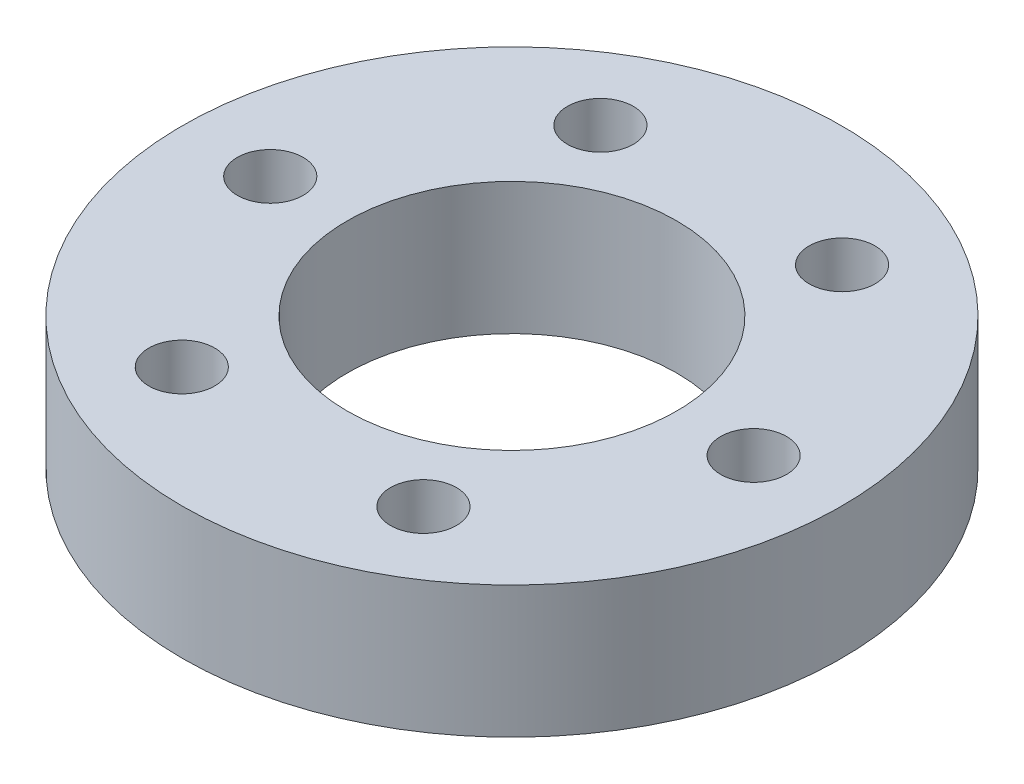
ISO-10303-21;
HEADER;
FILE_DESCRIPTION(('STEP AP214'),'2;1');
FILE_NAME('part.step','',(''),(''),'','','');
FILE_SCHEMA(('AUTOMOTIVE_DESIGN { 1 0 10303 214 1 1 1 1 }'));
ENDSEC;
DATA;
#1=APPLICATION_CONTEXT('core data for automotive mechanical design processes');
#2=APPLICATION_PROTOCOL_DEFINITION('international standard','automotive_design',2000,#1);
#3=PRODUCT_CONTEXT('',#1,'mechanical');
#4=PRODUCT('Part','Part','',(#3));
#5=PRODUCT_RELATED_PRODUCT_CATEGORY('part','',(#4));
#6=PRODUCT_DEFINITION_FORMATION('','',#4);
#7=PRODUCT_DEFINITION_CONTEXT('part definition',#1,'design');
#8=PRODUCT_DEFINITION('design','',#6,#7);
#9=PRODUCT_DEFINITION_SHAPE('','',#8);
#10=(LENGTH_UNIT() NAMED_UNIT(*) SI_UNIT(.MILLI.,.METRE.));
#11=(NAMED_UNIT(*) PLANE_ANGLE_UNIT() SI_UNIT($,.RADIAN.));
#12=(NAMED_UNIT(*) SI_UNIT($,.STERADIAN.) SOLID_ANGLE_UNIT());
#13=UNCERTAINTY_MEASURE_WITH_UNIT(LENGTH_MEASURE(1.E-05),#10,'distance_accuracy_value','');
#14=(GEOMETRIC_REPRESENTATION_CONTEXT(3) GLOBAL_UNCERTAINTY_ASSIGNED_CONTEXT((#13)) GLOBAL_UNIT_ASSIGNED_CONTEXT((#10,
#11,#12)) REPRESENTATION_CONTEXT('',''));
#15=CARTESIAN_POINT('',(0.,0.,0.));
#16=DIRECTION('',(0.,0.,1.));
#17=DIRECTION('',(1.,0.,0.));
#18=AXIS2_PLACEMENT_3D('',#15,#16,#17);
#19=CARTESIAN_POINT('',(0.,12.,0.));
#20=DIRECTION('',(0.,-1.,0.));
#21=DIRECTION('',(0.,0.,-1.));
#22=AXIS2_PLACEMENT_3D('',#19,#20,#21);
#23=CYLINDRICAL_SURFACE('',#22,30.);
#24=CARTESIAN_POINT('',(0.,12.,0.));
#25=DIRECTION('',(0.,1.,0.));
#26=DIRECTION('',(0.,0.,1.));
#27=AXIS2_PLACEMENT_3D('',#24,#25,#26);
#28=CIRCLE('',#27,30.);
#29=CARTESIAN_POINT('',(0.,12.,30.));
#30=VERTEX_POINT('',#29);
#31=EDGE_CURVE('E10',#30,#30,#28,.T.);
#32=ORIENTED_EDGE('',*,*,#31,.F.);
#33=EDGE_LOOP('',(#32));
#34=FACE_BOUND('',#33,.T.);
#35=CARTESIAN_POINT('',(0.,0.,0.));
#36=DIRECTION('',(0.,1.,0.));
#37=DIRECTION('',(0.,0.,1.));
#38=AXIS2_PLACEMENT_3D('',#35,#36,#37);
#39=CIRCLE('',#38,30.);
#40=CARTESIAN_POINT('',(0.,0.,30.));
#41=VERTEX_POINT('',#40);
#42=EDGE_CURVE('E37',#41,#41,#39,.T.);
#43=ORIENTED_EDGE('',*,*,#42,.T.);
#44=EDGE_LOOP('',(#43));
#45=FACE_BOUND('',#44,.T.);
#46=ADVANCED_FACE('F40',(#34,#45),#23,.T.);
#47=CARTESIAN_POINT('',(0.,12.,0.));
#48=DIRECTION('',(0.,1.,0.));
#49=DIRECTION('',(0.,0.,1.));
#50=AXIS2_PLACEMENT_3D('',#47,#48,#49);
#51=PLANE('',#50);
#52=CARTESIAN_POINT('',(11.,12.,-19.0525588832577));
#53=DIRECTION('',(0.,1.,0.));
#54=DIRECTION('',(0.866025403784439,0.,0.499999999999999));
#55=AXIS2_PLACEMENT_3D('',#52,#53,#54);
#56=CIRCLE('',#55,3.);
#57=CARTESIAN_POINT('',(13.5980762113533,12.,-17.5525588832577));
#58=VERTEX_POINT('',#57);
#59=EDGE_CURVE('E70',#58,#58,#56,.T.);
#60=ORIENTED_EDGE('',*,*,#59,.F.);
#61=EDGE_LOOP('',(#60));
#62=FACE_BOUND('',#61,.T.);
#63=CARTESIAN_POINT('',(-11.,12.,-19.0525588832576));
#64=DIRECTION('',(0.,1.,0.));
#65=DIRECTION('',(0.866025403784438,0.,-0.5));
#66=AXIS2_PLACEMENT_3D('',#63,#64,#65);
#67=CIRCLE('',#66,3.);
#68=CARTESIAN_POINT('',(-8.40192378864669,12.,-20.5525588832576));
#69=VERTEX_POINT('',#68);
#70=EDGE_CURVE('E78',#69,#69,#67,.T.);
#71=ORIENTED_EDGE('',*,*,#70,.F.);
#72=EDGE_LOOP('',(#71));
#73=FACE_BOUND('',#72,.T.);
#74=CARTESIAN_POINT('',(-22.,12.,0.));
#75=DIRECTION('',(0.,1.,0.));
#76=DIRECTION('',(0.,0.,-1.));
#77=AXIS2_PLACEMENT_3D('',#74,#75,#76);
#78=CIRCLE('',#77,3.);
#79=CARTESIAN_POINT('',(-22.,12.,-3.));
#80=VERTEX_POINT('',#79);
#81=EDGE_CURVE('E82',#80,#80,#78,.T.);
#82=ORIENTED_EDGE('',*,*,#81,.F.);
#83=EDGE_LOOP('',(#82));
#84=FACE_BOUND('',#83,.T.);
#85=CARTESIAN_POINT('',(-11.,12.,19.0525588832577));
#86=DIRECTION('',(0.,1.,0.));
#87=DIRECTION('',(-0.866025403784439,0.,-0.5));
#88=AXIS2_PLACEMENT_3D('',#85,#86,#87);
#89=CIRCLE('',#88,3.);
#90=CARTESIAN_POINT('',(-13.5980762113533,12.,17.5525588832577));
#91=VERTEX_POINT('',#90);
#92=EDGE_CURVE('E65',#91,#91,#89,.T.);
#93=ORIENTED_EDGE('',*,*,#92,.F.);
#94=EDGE_LOOP('',(#93));
#95=FACE_BOUND('',#94,.T.);
#96=CARTESIAN_POINT('',(11.,12.,19.0525588832576));
#97=DIRECTION('',(0.,1.,0.));
#98=DIRECTION('',(-0.866025403784439,0.,0.5));
#99=AXIS2_PLACEMENT_3D('',#96,#97,#98);
#100=CIRCLE('',#99,3.);
#101=CARTESIAN_POINT('',(8.40192378864668,12.,20.5525588832576));
#102=VERTEX_POINT('',#101);
#103=EDGE_CURVE('E59',#102,#102,#100,.T.);
#104=ORIENTED_EDGE('',*,*,#103,.F.);
#105=EDGE_LOOP('',(#104));
#106=FACE_BOUND('',#105,.T.);
#107=CARTESIAN_POINT('',(22.,12.,0.));
#108=DIRECTION('',(0.,1.,0.));
#109=DIRECTION('',(0.,0.,1.));
#110=AXIS2_PLACEMENT_3D('',#107,#108,#109);
#111=CIRCLE('',#110,3.);
#112=CARTESIAN_POINT('',(22.,12.,3.));
#113=VERTEX_POINT('',#112);
#114=EDGE_CURVE('E55',#113,#113,#111,.T.);
#115=ORIENTED_EDGE('',*,*,#114,.F.);
#116=EDGE_LOOP('',(#115));
#117=FACE_BOUND('',#116,.T.);
#118=CARTESIAN_POINT('',(0.,12.,0.));
#119=DIRECTION('',(0.,1.,0.));
#120=DIRECTION('',(0.,0.,1.));
#121=AXIS2_PLACEMENT_3D('',#118,#119,#120);
#122=CIRCLE('',#121,15.);
#123=CARTESIAN_POINT('',(0.,12.,15.));
#124=VERTEX_POINT('',#123);
#125=EDGE_CURVE('E50',#124,#124,#122,.T.);
#126=ORIENTED_EDGE('',*,*,#125,.F.);
#127=EDGE_LOOP('',(#126));
#128=FACE_BOUND('',#127,.T.);
#129=ORIENTED_EDGE('',*,*,#31,.T.);
#130=EDGE_LOOP('',(#129));
#131=FACE_BOUND('',#130,.T.);
#132=ADVANCED_FACE('F94',(#62,#73,#84,#95,#106,#117,#128,#131),#51,.T.);
#133=CARTESIAN_POINT('',(0.,0.,0.));
#134=DIRECTION('',(0.,1.,0.));
#135=DIRECTION('',(0.,0.,1.));
#136=AXIS2_PLACEMENT_3D('',#133,#134,#135);
#137=PLANE('',#136);
#138=CARTESIAN_POINT('',(11.,0.,-19.0525588832577));
#139=DIRECTION('',(0.,1.,0.));
#140=DIRECTION('',(0.866025403784439,0.,0.499999999999999));
#141=AXIS2_PLACEMENT_3D('',#138,#139,#140);
#142=CIRCLE('',#141,3.);
#143=CARTESIAN_POINT('',(13.5980762113533,0.,-17.5525588832577));
#144=VERTEX_POINT('',#143);
#145=EDGE_CURVE('E67',#144,#144,#142,.T.);
#146=ORIENTED_EDGE('',*,*,#145,.T.);
#147=EDGE_LOOP('',(#146));
#148=FACE_BOUND('',#147,.T.);
#149=CARTESIAN_POINT('',(-11.,0.,-19.0525588832576));
#150=DIRECTION('',(0.,1.,0.));
#151=DIRECTION('',(0.866025403784438,0.,-0.5));
#152=AXIS2_PLACEMENT_3D('',#149,#150,#151);
#153=CIRCLE('',#152,3.);
#154=CARTESIAN_POINT('',(-8.40192378864669,0.,-20.5525588832576));
#155=VERTEX_POINT('',#154);
#156=EDGE_CURVE('E71',#155,#155,#153,.T.);
#157=ORIENTED_EDGE('',*,*,#156,.T.);
#158=EDGE_LOOP('',(#157));
#159=FACE_BOUND('',#158,.T.);
#160=CARTESIAN_POINT('',(-22.,0.,0.));
#161=DIRECTION('',(0.,1.,0.));
#162=DIRECTION('',(0.,0.,-1.));
#163=AXIS2_PLACEMENT_3D('',#160,#161,#162);
#164=CIRCLE('',#163,3.);
#165=CARTESIAN_POINT('',(-22.,0.,-3.));
#166=VERTEX_POINT('',#165);
#167=EDGE_CURVE('E80',#166,#166,#164,.T.);
#168=ORIENTED_EDGE('',*,*,#167,.T.);
#169=EDGE_LOOP('',(#168));
#170=FACE_BOUND('',#169,.T.);
#171=CARTESIAN_POINT('',(-11.,0.,19.0525588832577));
#172=DIRECTION('',(0.,1.,0.));
#173=DIRECTION('',(-0.866025403784439,0.,-0.5));
#174=AXIS2_PLACEMENT_3D('',#171,#172,#173);
#175=CIRCLE('',#174,3.);
#176=CARTESIAN_POINT('',(-13.5980762113533,0.,17.5525588832577));
#177=VERTEX_POINT('',#176);
#178=EDGE_CURVE('E85',#177,#177,#175,.T.);
#179=ORIENTED_EDGE('',*,*,#178,.T.);
#180=EDGE_LOOP('',(#179));
#181=FACE_BOUND('',#180,.T.);
#182=CARTESIAN_POINT('',(11.,0.,19.0525588832576));
#183=DIRECTION('',(0.,1.,0.));
#184=DIRECTION('',(-0.866025403784439,0.,0.5));
#185=AXIS2_PLACEMENT_3D('',#182,#183,#184);
#186=CIRCLE('',#185,3.);
#187=CARTESIAN_POINT('',(8.40192378864668,0.,20.5525588832576));
#188=VERTEX_POINT('',#187);
#189=EDGE_CURVE('E63',#188,#188,#186,.T.);
#190=ORIENTED_EDGE('',*,*,#189,.T.);
#191=EDGE_LOOP('',(#190));
#192=FACE_BOUND('',#191,.T.);
#193=CARTESIAN_POINT('',(22.,0.,0.));
#194=DIRECTION('',(0.,1.,0.));
#195=DIRECTION('',(0.,0.,1.));
#196=AXIS2_PLACEMENT_3D('',#193,#194,#195);
#197=CIRCLE('',#196,3.);
#198=CARTESIAN_POINT('',(22.,0.,3.));
#199=VERTEX_POINT('',#198);
#200=EDGE_CURVE('E54',#199,#199,#197,.T.);
#201=ORIENTED_EDGE('',*,*,#200,.T.);
#202=EDGE_LOOP('',(#201));
#203=FACE_BOUND('',#202,.T.);
#204=CARTESIAN_POINT('',(0.,0.,0.));
#205=DIRECTION('',(0.,1.,0.));
#206=DIRECTION('',(0.,0.,1.));
#207=AXIS2_PLACEMENT_3D('',#204,#205,#206);
#208=CIRCLE('',#207,15.);
#209=CARTESIAN_POINT('',(0.,0.,15.));
#210=VERTEX_POINT('',#209);
#211=EDGE_CURVE('E47',#210,#210,#208,.T.);
#212=ORIENTED_EDGE('',*,*,#211,.T.);
#213=EDGE_LOOP('',(#212));
#214=FACE_BOUND('',#213,.T.);
#215=ORIENTED_EDGE('',*,*,#42,.F.);
#216=EDGE_LOOP('',(#215));
#217=FACE_BOUND('',#216,.T.);
#218=ADVANCED_FACE('F100',(#148,#159,#170,#181,#192,#203,#214,#217),#137,.F.);
#219=CARTESIAN_POINT('',(0.,12.,0.));
#220=DIRECTION('',(0.,-1.,0.));
#221=DIRECTION('',(0.,0.,-1.));
#222=AXIS2_PLACEMENT_3D('',#219,#220,#221);
#223=CYLINDRICAL_SURFACE('',#222,15.);
#224=ORIENTED_EDGE('',*,*,#125,.T.);
#225=EDGE_LOOP('',(#224));
#226=FACE_BOUND('',#225,.T.);
#227=ORIENTED_EDGE('',*,*,#211,.F.);
#228=EDGE_LOOP('',(#227));
#229=FACE_BOUND('',#228,.T.);
#230=ADVANCED_FACE('F106',(#226,#229),#223,.F.);
#231=CARTESIAN_POINT('',(22.,12.,0.));
#232=DIRECTION('',(0.,-1.,0.));
#233=DIRECTION('',(0.,0.,-1.));
#234=AXIS2_PLACEMENT_3D('',#231,#232,#233);
#235=CYLINDRICAL_SURFACE('',#234,3.);
#236=ORIENTED_EDGE('',*,*,#114,.T.);
#237=EDGE_LOOP('',(#236));
#238=FACE_BOUND('',#237,.T.);
#239=ORIENTED_EDGE('',*,*,#200,.F.);
#240=EDGE_LOOP('',(#239));
#241=FACE_BOUND('',#240,.T.);
#242=ADVANCED_FACE('F108',(#238,#241),#235,.F.);
#243=CARTESIAN_POINT('',(11.,12.,19.0525588832576));
#244=DIRECTION('',(0.,-1.,0.));
#245=DIRECTION('',(0.,0.,-1.));
#246=AXIS2_PLACEMENT_3D('',#243,#244,#245);
#247=CYLINDRICAL_SURFACE('',#246,3.);
#248=ORIENTED_EDGE('',*,*,#103,.T.);
#249=EDGE_LOOP('',(#248));
#250=FACE_BOUND('',#249,.T.);
#251=ORIENTED_EDGE('',*,*,#189,.F.);
#252=EDGE_LOOP('',(#251));
#253=FACE_BOUND('',#252,.T.);
#254=ADVANCED_FACE('F131',(#250,#253),#247,.F.);
#255=CARTESIAN_POINT('',(-11.,12.,19.0525588832577));
#256=DIRECTION('',(0.,-1.,0.));
#257=DIRECTION('',(0.,0.,-1.));
#258=AXIS2_PLACEMENT_3D('',#255,#256,#257);
#259=CYLINDRICAL_SURFACE('',#258,3.);
#260=ORIENTED_EDGE('',*,*,#92,.T.);
#261=EDGE_LOOP('',(#260));
#262=FACE_BOUND('',#261,.T.);
#263=ORIENTED_EDGE('',*,*,#178,.F.);
#264=EDGE_LOOP('',(#263));
#265=FACE_BOUND('',#264,.T.);
#266=ADVANCED_FACE('F93',(#262,#265),#259,.F.);
#267=CARTESIAN_POINT('',(-22.,12.,0.));
#268=DIRECTION('',(0.,-1.,0.));
#269=DIRECTION('',(0.,0.,-1.));
#270=AXIS2_PLACEMENT_3D('',#267,#268,#269);
#271=CYLINDRICAL_SURFACE('',#270,3.);
#272=ORIENTED_EDGE('',*,*,#81,.T.);
#273=EDGE_LOOP('',(#272));
#274=FACE_BOUND('',#273,.T.);
#275=ORIENTED_EDGE('',*,*,#167,.F.);
#276=EDGE_LOOP('',(#275));
#277=FACE_BOUND('',#276,.T.);
#278=ADVANCED_FACE('F161',(#274,#277),#271,.F.);
#279=CARTESIAN_POINT('',(-11.,12.,-19.0525588832576));
#280=DIRECTION('',(0.,-1.,0.));
#281=DIRECTION('',(0.,0.,-1.));
#282=AXIS2_PLACEMENT_3D('',#279,#280,#281);
#283=CYLINDRICAL_SURFACE('',#282,3.);
#284=ORIENTED_EDGE('',*,*,#70,.T.);
#285=EDGE_LOOP('',(#284));
#286=FACE_BOUND('',#285,.T.);
#287=ORIENTED_EDGE('',*,*,#156,.F.);
#288=EDGE_LOOP('',(#287));
#289=FACE_BOUND('',#288,.T.);
#290=ADVANCED_FACE('F166',(#286,#289),#283,.F.);
#291=CARTESIAN_POINT('',(11.,12.,-19.0525588832577));
#292=DIRECTION('',(0.,-1.,0.));
#293=DIRECTION('',(0.,0.,-1.));
#294=AXIS2_PLACEMENT_3D('',#291,#292,#293);
#295=CYLINDRICAL_SURFACE('',#294,3.);
#296=ORIENTED_EDGE('',*,*,#59,.T.);
#297=EDGE_LOOP('',(#296));
#298=FACE_BOUND('',#297,.T.);
#299=ORIENTED_EDGE('',*,*,#145,.F.);
#300=EDGE_LOOP('',(#299));
#301=FACE_BOUND('',#300,.T.);
#302=ADVANCED_FACE('F179',(#298,#301),#295,.F.);
#303=CLOSED_SHELL('',(#46,#132,#218,#230,#242,#254,#266,#278,#290,#302));
#304=MANIFOLD_SOLID_BREP('B2',#303);
#305=ADVANCED_BREP_SHAPE_REPRESENTATION('',(#18,#304),#14);
#306=SHAPE_DEFINITION_REPRESENTATION(#9,#305);
ENDSEC;
END-ISO-10303-21;
